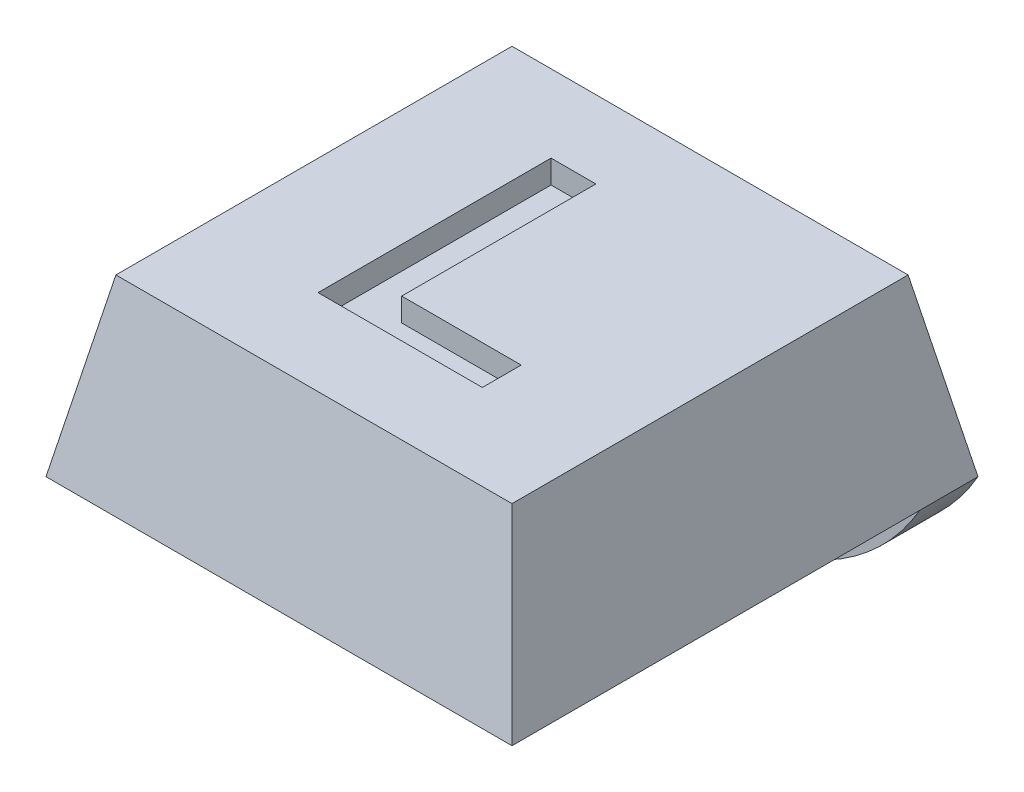
ISO-10303-21;
HEADER;
FILE_DESCRIPTION(('STEP AP214'),'2;1');
FILE_NAME('part.step','',(''),(''),'','','');
FILE_SCHEMA(('AUTOMOTIVE_DESIGN { 1 0 10303 214 1 1 1 1 }'));
ENDSEC;
DATA;
#1=APPLICATION_CONTEXT('core data for automotive mechanical design processes');
#2=APPLICATION_PROTOCOL_DEFINITION('international standard','automotive_design',2000,#1);
#3=PRODUCT_CONTEXT('',#1,'mechanical');
#4=PRODUCT('Part','Part','',(#3));
#5=PRODUCT_RELATED_PRODUCT_CATEGORY('part','',(#4));
#6=PRODUCT_DEFINITION_FORMATION('','',#4);
#7=PRODUCT_DEFINITION_CONTEXT('part definition',#1,'design');
#8=PRODUCT_DEFINITION('design','',#6,#7);
#9=PRODUCT_DEFINITION_SHAPE('','',#8);
#10=(LENGTH_UNIT() NAMED_UNIT(*) SI_UNIT(.MILLI.,.METRE.));
#11=(NAMED_UNIT(*) PLANE_ANGLE_UNIT() SI_UNIT($,.RADIAN.));
#12=(NAMED_UNIT(*) SI_UNIT($,.STERADIAN.) SOLID_ANGLE_UNIT());
#13=UNCERTAINTY_MEASURE_WITH_UNIT(LENGTH_MEASURE(1.E-05),#10,'distance_accuracy_value','');
#14=(GEOMETRIC_REPRESENTATION_CONTEXT(3) GLOBAL_UNCERTAINTY_ASSIGNED_CONTEXT((#13)) GLOBAL_UNIT_ASSIGNED_CONTEXT((#10,
#11,#12)) REPRESENTATION_CONTEXT('',''));
#15=CARTESIAN_POINT('',(0.,0.,0.));
#16=DIRECTION('',(0.,0.,1.));
#17=DIRECTION('',(1.,0.,0.));
#18=AXIS2_PLACEMENT_3D('',#15,#16,#17);
#19=CARTESIAN_POINT('',(0.,3.,0.));
#20=DIRECTION('',(0.,-1.,0.));
#21=DIRECTION('',(0.,0.,-1.));
#22=AXIS2_PLACEMENT_3D('',#19,#20,#21);
#23=PLANE('',#22);
#24=DIRECTION('',(-1.,0.,0.));
#25=VECTOR('',#24,1.);
#26=CARTESIAN_POINT('',(11.,3.,-0.6));
#27=LINE('',#26,#25);
#28=CARTESIAN_POINT('',(7.4,3.,-0.6));
#29=VERTEX_POINT('',#28);
#30=CARTESIAN_POINT('',(0.6,3.,-0.6));
#31=VERTEX_POINT('',#30);
#32=EDGE_CURVE('E193',#29,#31,#27,.T.);
#33=ORIENTED_EDGE('',*,*,#32,.F.);
#34=DIRECTION('',(0.,0.,1.));
#35=VECTOR('',#34,1.);
#36=CARTESIAN_POINT('',(7.4,3.,-8.));
#37=LINE('',#36,#35);
#38=CARTESIAN_POINT('',(7.4,3.,-7.4));
#39=VERTEX_POINT('',#38);
#40=EDGE_CURVE('E206',#39,#29,#37,.T.);
#41=ORIENTED_EDGE('',*,*,#40,.F.);
#42=DIRECTION('',(-1.,0.,0.));
#43=VECTOR('',#42,1.);
#44=CARTESIAN_POINT('',(11.,3.,-7.4));
#45=LINE('',#44,#43);
#46=CARTESIAN_POINT('',(0.599999999999999,3.,-7.4));
#47=VERTEX_POINT('',#46);
#48=EDGE_CURVE('E189',#39,#47,#45,.T.);
#49=ORIENTED_EDGE('',*,*,#48,.T.);
#50=DIRECTION('',(0.,0.,1.));
#51=VECTOR('',#50,1.);
#52=CARTESIAN_POINT('',(0.6,3.,-8.));
#53=LINE('',#52,#51);
#54=EDGE_CURVE('E209',#47,#31,#53,.T.);
#55=ORIENTED_EDGE('',*,*,#54,.T.);
#56=EDGE_LOOP('',(#33,#41,#49,#55));
#57=FACE_BOUND('',#56,.T.);
#58=DIRECTION('',(-1.,0.,0.));
#59=VECTOR('',#58,1.);
#60=CARTESIAN_POINT('',(5.41871403816439,3.,-2.07225420999487));
#61=LINE('',#60,#59);
#62=CARTESIAN_POINT('',(5.41871403816439,3.,-2.07225420999487));
#63=VERTEX_POINT('',#62);
#64=CARTESIAN_POINT('',(2.59820121765157,3.,-2.07225420999487));
#65=VERTEX_POINT('',#64);
#66=EDGE_CURVE('E58',#63,#65,#61,.T.);
#67=ORIENTED_EDGE('',*,*,#66,.T.);
#68=DIRECTION('',(0.,0.,-1.));
#69=VECTOR('',#68,1.);
#70=CARTESIAN_POINT('',(2.59820121765157,3.,-2.07225420999487));
#71=LINE('',#70,#69);
#72=CARTESIAN_POINT('',(2.59820121765157,3.,-6.07225420999487));
#73=VERTEX_POINT('',#72);
#74=EDGE_CURVE('E161',#65,#73,#71,.T.);
#75=ORIENTED_EDGE('',*,*,#74,.T.);
#76=DIRECTION('',(1.,0.,0.));
#77=VECTOR('',#76,1.);
#78=CARTESIAN_POINT('',(2.59820121765157,3.,-6.07225420999487));
#79=LINE('',#78,#77);
#80=CARTESIAN_POINT('',(3.36743198688234,3.,-6.07225420999487));
#81=VERTEX_POINT('',#80);
#82=EDGE_CURVE('E524',#73,#81,#79,.T.);
#83=ORIENTED_EDGE('',*,*,#82,.T.);
#84=DIRECTION('',(0.,0.,1.));
#85=VECTOR('',#84,1.);
#86=CARTESIAN_POINT('',(3.36743198688234,3.,-6.07225420999487));
#87=LINE('',#86,#85);
#88=CARTESIAN_POINT('',(3.36743198688234,3.,-2.73892087666153));
#89=VERTEX_POINT('',#88);
#90=EDGE_CURVE('E519',#81,#89,#87,.T.);
#91=ORIENTED_EDGE('',*,*,#90,.T.);
#92=DIRECTION('',(1.,0.,0.));
#93=VECTOR('',#92,1.);
#94=CARTESIAN_POINT('',(3.36743198688234,3.,-2.73892087666153));
#95=LINE('',#94,#93);
#96=CARTESIAN_POINT('',(5.41871403816439,3.,-2.73892087666153));
#97=VERTEX_POINT('',#96);
#98=EDGE_CURVE('E513',#89,#97,#95,.T.);
#99=ORIENTED_EDGE('',*,*,#98,.T.);
#100=DIRECTION('',(0.,0.,1.));
#101=VECTOR('',#100,1.);
#102=CARTESIAN_POINT('',(5.41871403816439,3.,-2.73892087666153));
#103=LINE('',#102,#101);
#104=EDGE_CURVE('E157',#97,#63,#103,.T.);
#105=ORIENTED_EDGE('',*,*,#104,.T.);
#106=EDGE_LOOP('',(#67,#75,#83,#91,#99,#105));
#107=FACE_BOUND('',#106,.T.);
#108=ADVANCED_FACE('F42',(#57,#107),#23,.F.);
#109=CARTESIAN_POINT('',(8.,0.,-8.));
#110=DIRECTION('',(-0.98058067569092,-0.196116135138184,0.));
#111=DIRECTION('',(0.196116135138184,-0.98058067569092,0.));
#112=AXIS2_PLACEMENT_3D('',#109,#110,#111);
#113=PLANE('',#112);
#114=DIRECTION('',(-0.192450089729875,0.962250448649376,-0.192450089729875));
#115=VECTOR('',#114,1.);
#116=CARTESIAN_POINT('',(7.7037037037037,1.48148148148148,-0.296296296296296));
#117=LINE('',#116,#115);
#118=CARTESIAN_POINT('',(8.,0.,0.));
#119=VERTEX_POINT('',#118);
#120=EDGE_CURVE('E203',#119,#29,#117,.T.);
#121=ORIENTED_EDGE('',*,*,#120,.F.);
#122=DIRECTION('',(0.,0.,-1.));
#123=VECTOR('',#122,1.);
#124=CARTESIAN_POINT('',(8.,0.,0.));
#125=LINE('',#124,#123);
#126=CARTESIAN_POINT('',(8.,0.,-7.));
#127=VERTEX_POINT('',#126);
#128=EDGE_CURVE('E222',#119,#127,#125,.T.);
#129=ORIENTED_EDGE('',*,*,#128,.T.);
#130=DIRECTION('',(0.,0.,1.));
#131=VECTOR('',#130,1.);
#132=CARTESIAN_POINT('',(8.,0.,-8.));
#133=LINE('',#132,#131);
#134=CARTESIAN_POINT('',(8.,0.,-8.));
#135=VERTEX_POINT('',#134);
#136=EDGE_CURVE('E163',#135,#127,#133,.T.);
#137=ORIENTED_EDGE('',*,*,#136,.F.);
#138=DIRECTION('',(0.192450089729875,-0.962250448649376,-0.192450089729875));
#139=VECTOR('',#138,1.);
#140=CARTESIAN_POINT('',(8.,0.,-8.));
#141=LINE('',#140,#139);
#142=EDGE_CURVE('E196',#39,#135,#141,.T.);
#143=ORIENTED_EDGE('',*,*,#142,.F.);
#144=ORIENTED_EDGE('',*,*,#40,.T.);
#145=EDGE_LOOP('',(#121,#129,#137,#143,#144));
#146=FACE_BOUND('',#145,.T.);
#147=ADVANCED_FACE('F290',(#146),#113,.F.);
#148=CARTESIAN_POINT('',(0.,0.,-8.));
#149=DIRECTION('',(0.98058067569092,-0.196116135138184,0.));
#150=DIRECTION('',(0.196116135138184,0.98058067569092,0.));
#151=AXIS2_PLACEMENT_3D('',#148,#149,#150);
#152=PLANE('',#151);
#153=DIRECTION('',(-0.192450089729875,-0.962250448649376,0.192450089729875));
#154=VECTOR('',#153,1.);
#155=CARTESIAN_POINT('',(0.296296296296296,1.48148148148148,-0.296296296296296));
#156=LINE('',#155,#154);
#157=CARTESIAN_POINT('',(0.,0.,0.));
#158=VERTEX_POINT('',#157);
#159=EDGE_CURVE('E250',#31,#158,#156,.T.);
#160=ORIENTED_EDGE('',*,*,#159,.F.);
#161=ORIENTED_EDGE('',*,*,#54,.F.);
#162=DIRECTION('',(0.192450089729875,0.962250448649376,0.192450089729875));
#163=VECTOR('',#162,1.);
#164=CARTESIAN_POINT('',(0.,0.,-8.));
#165=LINE('',#164,#163);
#166=CARTESIAN_POINT('',(0.,0.,-8.));
#167=VERTEX_POINT('',#166);
#168=EDGE_CURVE('E221',#167,#47,#165,.T.);
#169=ORIENTED_EDGE('',*,*,#168,.F.);
#170=DIRECTION('',(0.,0.,1.));
#171=VECTOR('',#170,1.);
#172=CARTESIAN_POINT('',(0.,0.,0.));
#173=LINE('',#172,#171);
#174=CARTESIAN_POINT('',(0.,0.,-7.));
#175=VERTEX_POINT('',#174);
#176=EDGE_CURVE('E226',#167,#175,#173,.T.);
#177=ORIENTED_EDGE('',*,*,#176,.T.);
#178=EDGE_CURVE('E213',#175,#158,#173,.T.);
#179=ORIENTED_EDGE('',*,*,#178,.T.);
#180=EDGE_LOOP('',(#160,#161,#169,#177,#179));
#181=FACE_BOUND('',#180,.T.);
#182=ADVANCED_FACE('F274',(#181),#152,.F.);
#183=CARTESIAN_POINT('',(0.,0.,0.));
#184=DIRECTION('',(0.,-1.,0.));
#185=DIRECTION('',(0.,0.,-1.));
#186=AXIS2_PLACEMENT_3D('',#183,#184,#185);
#187=PLANE('',#186);
#188=DIRECTION('',(-1.,0.,0.));
#189=VECTOR('',#188,1.);
#190=CARTESIAN_POINT('',(0.,0.,-7.));
#191=LINE('',#190,#189);
#192=EDGE_CURVE('E169',#127,#175,#191,.T.);
#193=ORIENTED_EDGE('',*,*,#192,.F.);
#194=ORIENTED_EDGE('',*,*,#128,.F.);
#195=DIRECTION('',(1.,0.,0.));
#196=VECTOR('',#195,1.);
#197=CARTESIAN_POINT('',(0.,0.,0.));
#198=LINE('',#197,#196);
#199=EDGE_CURVE('E223',#158,#119,#198,.T.);
#200=ORIENTED_EDGE('',*,*,#199,.F.);
#201=ORIENTED_EDGE('',*,*,#178,.F.);
#202=EDGE_LOOP('',(#193,#194,#200,#201));
#203=FACE_BOUND('',#202,.T.);
#204=CARTESIAN_POINT('',(4.,0.,-3.75));
#205=DIRECTION('',(0.,-1.,0.));
#206=DIRECTION('',(0.,0.,-1.));
#207=AXIS2_PLACEMENT_3D('',#204,#205,#206);
#208=CIRCLE('',#207,1.8);
#209=CARTESIAN_POINT('',(4.,0.,-5.55));
#210=VERTEX_POINT('',#209);
#211=EDGE_CURVE('E181',#210,#210,#208,.T.);
#212=ORIENTED_EDGE('',*,*,#211,.F.);
#213=EDGE_LOOP('',(#212));
#214=FACE_BOUND('',#213,.T.);
#215=ADVANCED_FACE('F285',(#203,#214),#187,.T.);
#216=CARTESIAN_POINT('',(11.,3.,-7.4));
#217=DIRECTION('',(0.,0.196116135138184,-0.98058067569092));
#218=DIRECTION('',(0.,0.98058067569092,0.196116135138184));
#219=AXIS2_PLACEMENT_3D('',#216,#217,#218);
#220=PLANE('',#219);
#221=ORIENTED_EDGE('',*,*,#142,.T.);
#222=DIRECTION('',(-1.,0.,0.));
#223=VECTOR('',#222,1.);
#224=CARTESIAN_POINT('',(0.,0.,-8.));
#225=LINE('',#224,#223);
#226=EDGE_CURVE('E217',#135,#167,#225,.T.);
#227=ORIENTED_EDGE('',*,*,#226,.T.);
#228=ORIENTED_EDGE('',*,*,#168,.T.);
#229=ORIENTED_EDGE('',*,*,#48,.F.);
#230=EDGE_LOOP('',(#221,#227,#228,#229));
#231=FACE_BOUND('',#230,.T.);
#232=ADVANCED_FACE('F269',(#231),#220,.T.);
#233=CARTESIAN_POINT('',(11.,0.,0.));
#234=DIRECTION('',(0.,0.196116135138184,0.98058067569092));
#235=DIRECTION('',(0.,-0.98058067569092,0.196116135138184));
#236=AXIS2_PLACEMENT_3D('',#233,#234,#235);
#237=PLANE('',#236);
#238=ORIENTED_EDGE('',*,*,#120,.T.);
#239=ORIENTED_EDGE('',*,*,#32,.T.);
#240=ORIENTED_EDGE('',*,*,#159,.T.);
#241=ORIENTED_EDGE('',*,*,#199,.T.);
#242=EDGE_LOOP('',(#238,#239,#240,#241));
#243=FACE_BOUND('',#242,.T.);
#244=ADVANCED_FACE('F316',(#243),#237,.T.);
#245=CARTESIAN_POINT('',(4.,0.8,-3.75));
#246=DIRECTION('',(0.,-1.,0.));
#247=DIRECTION('',(0.,0.,-1.));
#248=AXIS2_PLACEMENT_3D('',#245,#246,#247);
#249=CYLINDRICAL_SURFACE('',#248,1.8);
#250=CARTESIAN_POINT('',(4.,0.8,-3.75));
#251=DIRECTION('',(0.,-1.,0.));
#252=DIRECTION('',(0.,0.,-1.));
#253=AXIS2_PLACEMENT_3D('',#250,#251,#252);
#254=CIRCLE('',#253,1.8);
#255=CARTESIAN_POINT('',(4.,0.8,-5.55));
#256=VERTEX_POINT('',#255);
#257=EDGE_CURVE('E185',#256,#256,#254,.T.);
#258=ORIENTED_EDGE('',*,*,#257,.F.);
#259=EDGE_LOOP('',(#258));
#260=FACE_BOUND('',#259,.T.);
#261=ORIENTED_EDGE('',*,*,#211,.T.);
#262=EDGE_LOOP('',(#261));
#263=FACE_BOUND('',#262,.T.);
#264=ADVANCED_FACE('F323',(#260,#263),#249,.F.);
#265=CARTESIAN_POINT('',(4.,0.8,-3.75));
#266=DIRECTION('',(0.,-1.,0.));
#267=DIRECTION('',(0.,0.,-1.));
#268=AXIS2_PLACEMENT_3D('',#265,#266,#267);
#269=PLANE('',#268);
#270=ORIENTED_EDGE('',*,*,#257,.T.);
#271=EDGE_LOOP('',(#270));
#272=FACE_BOUND('',#271,.T.);
#273=ADVANCED_FACE('F327',(#272),#269,.T.);
#274=CARTESIAN_POINT('',(0.,-2.,-8.));
#275=DIRECTION('',(0.,0.,1.));
#276=DIRECTION('',(1.,0.,0.));
#277=AXIS2_PLACEMENT_3D('',#274,#275,#276);
#278=PLANE('',#277);
#279=ORIENTED_EDGE('',*,*,#226,.F.);
#280=CARTESIAN_POINT('',(4.53589838486225,2.,-8.));
#281=DIRECTION('',(0.,0.,1.));
#282=DIRECTION('',(1.,0.,0.));
#283=AXIS2_PLACEMENT_3D('',#280,#281,#282);
#284=CIRCLE('',#283,4.);
#285=CARTESIAN_POINT('',(4.53589838486225,-2.,-8.));
#286=VERTEX_POINT('',#285);
#287=EDGE_CURVE('E11',#135,#286,#284,.F.);
#288=ORIENTED_EDGE('',*,*,#287,.T.);
#289=DIRECTION('',(1.,0.,0.));
#290=VECTOR('',#289,1.);
#291=CARTESIAN_POINT('',(0.,-2.,-8.));
#292=LINE('',#291,#290);
#293=CARTESIAN_POINT('',(3.46410161513775,-2.,-8.));
#294=VERTEX_POINT('',#293);
#295=EDGE_CURVE('E175',#294,#286,#292,.T.);
#296=ORIENTED_EDGE('',*,*,#295,.F.);
#297=CARTESIAN_POINT('',(3.46410161513775,2.,-8.));
#298=DIRECTION('',(0.,0.,1.));
#299=DIRECTION('',(1.,0.,0.));
#300=AXIS2_PLACEMENT_3D('',#297,#298,#299);
#301=CIRCLE('',#300,4.);
#302=EDGE_CURVE('E51',#294,#167,#301,.F.);
#303=ORIENTED_EDGE('',*,*,#302,.T.);
#304=EDGE_LOOP('',(#279,#288,#296,#303));
#305=FACE_BOUND('',#304,.T.);
#306=ADVANCED_FACE('F262',(#305),#278,.F.);
#307=CARTESIAN_POINT('',(0.,-2.,-7.));
#308=DIRECTION('',(0.,0.,-1.));
#309=DIRECTION('',(-1.,0.,0.));
#310=AXIS2_PLACEMENT_3D('',#307,#308,#309);
#311=PLANE('',#310);
#312=DIRECTION('',(-1.,0.,0.));
#313=VECTOR('',#312,1.);
#314=CARTESIAN_POINT('',(0.,-2.,-7.));
#315=LINE('',#314,#313);
#316=CARTESIAN_POINT('',(4.53589838486225,-2.,-7.));
#317=VERTEX_POINT('',#316);
#318=CARTESIAN_POINT('',(3.46410161513775,-2.,-7.));
#319=VERTEX_POINT('',#318);
#320=EDGE_CURVE('E179',#317,#319,#315,.T.);
#321=ORIENTED_EDGE('',*,*,#320,.F.);
#322=CARTESIAN_POINT('',(4.53589838486225,2.,-7.));
#323=DIRECTION('',(0.,0.,-1.));
#324=DIRECTION('',(-1.,0.,0.));
#325=AXIS2_PLACEMENT_3D('',#322,#323,#324);
#326=CIRCLE('',#325,4.);
#327=EDGE_CURVE('E256',#317,#127,#326,.F.);
#328=ORIENTED_EDGE('',*,*,#327,.T.);
#329=ORIENTED_EDGE('',*,*,#192,.T.);
#330=CARTESIAN_POINT('',(3.46410161513775,2.,-7.));
#331=DIRECTION('',(0.,0.,-1.));
#332=DIRECTION('',(-1.,0.,0.));
#333=AXIS2_PLACEMENT_3D('',#330,#331,#332);
#334=CIRCLE('',#333,4.);
#335=EDGE_CURVE('E66',#175,#319,#334,.F.);
#336=ORIENTED_EDGE('',*,*,#335,.T.);
#337=EDGE_LOOP('',(#321,#328,#329,#336));
#338=FACE_BOUND('',#337,.T.);
#339=ADVANCED_FACE('F280',(#338),#311,.F.);
#340=CARTESIAN_POINT('',(0.,-2.,0.));
#341=DIRECTION('',(0.,1.,0.));
#342=DIRECTION('',(0.,0.,1.));
#343=AXIS2_PLACEMENT_3D('',#340,#341,#342);
#344=PLANE('',#343);
#345=ORIENTED_EDGE('',*,*,#295,.T.);
#346=DIRECTION('',(0.,0.,1.));
#347=VECTOR('',#346,1.);
#348=CARTESIAN_POINT('',(4.53589838486225,-2.,0.));
#349=LINE('',#348,#347);
#350=EDGE_CURVE('E249',#286,#317,#349,.T.);
#351=ORIENTED_EDGE('',*,*,#350,.T.);
#352=ORIENTED_EDGE('',*,*,#320,.T.);
#353=DIRECTION('',(0.,0.,-1.));
#354=VECTOR('',#353,1.);
#355=CARTESIAN_POINT('',(3.46410161513775,-2.,0.));
#356=LINE('',#355,#354);
#357=EDGE_CURVE('E245',#319,#294,#356,.T.);
#358=ORIENTED_EDGE('',*,*,#357,.T.);
#359=EDGE_LOOP('',(#345,#351,#352,#358));
#360=FACE_BOUND('',#359,.T.);
#361=ADVANCED_FACE('F278',(#360),#344,.F.);
#362=CARTESIAN_POINT('',(4.53589838486225,2.,-8.));
#363=DIRECTION('',(0.,0.,1.));
#364=DIRECTION('',(1.,0.,0.));
#365=AXIS2_PLACEMENT_3D('',#362,#363,#364);
#366=CYLINDRICAL_SURFACE('',#365,4.);
#367=ORIENTED_EDGE('',*,*,#287,.F.);
#368=ORIENTED_EDGE('',*,*,#136,.T.);
#369=ORIENTED_EDGE('',*,*,#327,.F.);
#370=ORIENTED_EDGE('',*,*,#350,.F.);
#371=EDGE_LOOP('',(#367,#368,#369,#370));
#372=FACE_BOUND('',#371,.T.);
#373=ADVANCED_FACE('F291',(#372),#366,.T.);
#374=CARTESIAN_POINT('',(3.46410161513775,2.,-8.));
#375=DIRECTION('',(0.,0.,-1.));
#376=DIRECTION('',(-1.,0.,0.));
#377=AXIS2_PLACEMENT_3D('',#374,#375,#376);
#378=CYLINDRICAL_SURFACE('',#377,4.);
#379=ORIENTED_EDGE('',*,*,#335,.F.);
#380=ORIENTED_EDGE('',*,*,#176,.F.);
#381=ORIENTED_EDGE('',*,*,#302,.F.);
#382=ORIENTED_EDGE('',*,*,#357,.F.);
#383=EDGE_LOOP('',(#379,#380,#381,#382));
#384=FACE_BOUND('',#383,.T.);
#385=ADVANCED_FACE('F44',(#384),#378,.T.);
#386=CARTESIAN_POINT('',(5.41871403816439,2.6,-2.07225420999487));
#387=DIRECTION('',(0.,0.,-1.));
#388=DIRECTION('',(-1.,0.,0.));
#389=AXIS2_PLACEMENT_3D('',#386,#387,#388);
#390=PLANE('',#389);
#391=ORIENTED_EDGE('',*,*,#66,.F.);
#392=DIRECTION('',(0.,1.,0.));
#393=VECTOR('',#392,1.);
#394=CARTESIAN_POINT('',(5.41871403816439,2.6,-2.07225420999487));
#395=LINE('',#394,#393);
#396=CARTESIAN_POINT('',(5.41871403816439,2.6,-2.07225420999487));
#397=VERTEX_POINT('',#396);
#398=EDGE_CURVE('E155',#397,#63,#395,.T.);
#399=ORIENTED_EDGE('',*,*,#398,.F.);
#400=DIRECTION('',(-1.,0.,0.));
#401=VECTOR('',#400,1.);
#402=CARTESIAN_POINT('',(5.41871403816439,2.6,-2.07225420999487));
#403=LINE('',#402,#401);
#404=CARTESIAN_POINT('',(2.59820121765157,2.6,-2.07225420999487));
#405=VERTEX_POINT('',#404);
#406=EDGE_CURVE('E145',#397,#405,#403,.T.);
#407=ORIENTED_EDGE('',*,*,#406,.T.);
#408=DIRECTION('',(0.,1.,0.));
#409=VECTOR('',#408,1.);
#410=CARTESIAN_POINT('',(2.59820121765157,2.6,-2.07225420999487));
#411=LINE('',#410,#409);
#412=EDGE_CURVE('E154',#405,#65,#411,.T.);
#413=ORIENTED_EDGE('',*,*,#412,.T.);
#414=EDGE_LOOP('',(#391,#399,#407,#413));
#415=FACE_BOUND('',#414,.T.);
#416=ADVANCED_FACE('F153',(#415),#390,.T.);
#417=CARTESIAN_POINT('',(2.59820121765157,2.6,-2.07225420999487));
#418=DIRECTION('',(1.,0.,0.));
#419=DIRECTION('',(0.,0.,-1.));
#420=AXIS2_PLACEMENT_3D('',#417,#418,#419);
#421=PLANE('',#420);
#422=ORIENTED_EDGE('',*,*,#74,.F.);
#423=ORIENTED_EDGE('',*,*,#412,.F.);
#424=DIRECTION('',(0.,0.,-1.));
#425=VECTOR('',#424,1.);
#426=CARTESIAN_POINT('',(2.59820121765157,2.6,-2.07225420999487));
#427=LINE('',#426,#425);
#428=CARTESIAN_POINT('',(2.59820121765157,2.6,-6.07225420999487));
#429=VERTEX_POINT('',#428);
#430=EDGE_CURVE('E141',#405,#429,#427,.T.);
#431=ORIENTED_EDGE('',*,*,#430,.T.);
#432=DIRECTION('',(0.,1.,0.));
#433=VECTOR('',#432,1.);
#434=CARTESIAN_POINT('',(2.59820121765157,2.6,-6.07225420999487));
#435=LINE('',#434,#433);
#436=EDGE_CURVE('E164',#429,#73,#435,.T.);
#437=ORIENTED_EDGE('',*,*,#436,.T.);
#438=EDGE_LOOP('',(#422,#423,#431,#437));
#439=FACE_BOUND('',#438,.T.);
#440=ADVANCED_FACE('F159',(#439),#421,.T.);
#441=CARTESIAN_POINT('',(2.59820121765157,2.6,-6.07225420999487));
#442=DIRECTION('',(0.,0.,1.));
#443=DIRECTION('',(1.,0.,0.));
#444=AXIS2_PLACEMENT_3D('',#441,#442,#443);
#445=PLANE('',#444);
#446=ORIENTED_EDGE('',*,*,#82,.F.);
#447=ORIENTED_EDGE('',*,*,#436,.F.);
#448=DIRECTION('',(1.,0.,0.));
#449=VECTOR('',#448,1.);
#450=CARTESIAN_POINT('',(2.59820121765157,2.6,-6.07225420999487));
#451=LINE('',#450,#449);
#452=CARTESIAN_POINT('',(3.36743198688234,2.6,-6.07225420999487));
#453=VERTEX_POINT('',#452);
#454=EDGE_CURVE('E147',#429,#453,#451,.T.);
#455=ORIENTED_EDGE('',*,*,#454,.T.);
#456=DIRECTION('',(0.,1.,0.));
#457=VECTOR('',#456,1.);
#458=CARTESIAN_POINT('',(3.36743198688234,2.6,-6.07225420999487));
#459=LINE('',#458,#457);
#460=EDGE_CURVE('E171',#453,#81,#459,.T.);
#461=ORIENTED_EDGE('',*,*,#460,.T.);
#462=EDGE_LOOP('',(#446,#447,#455,#461));
#463=FACE_BOUND('',#462,.T.);
#464=ADVANCED_FACE('F340',(#463),#445,.T.);
#465=CARTESIAN_POINT('',(3.36743198688234,2.6,-6.07225420999487));
#466=DIRECTION('',(-1.,0.,0.));
#467=DIRECTION('',(0.,0.,1.));
#468=AXIS2_PLACEMENT_3D('',#465,#466,#467);
#469=PLANE('',#468);
#470=ORIENTED_EDGE('',*,*,#90,.F.);
#471=ORIENTED_EDGE('',*,*,#460,.F.);
#472=DIRECTION('',(0.,0.,1.));
#473=VECTOR('',#472,1.);
#474=CARTESIAN_POINT('',(3.36743198688234,2.6,-6.07225420999487));
#475=LINE('',#474,#473);
#476=CARTESIAN_POINT('',(3.36743198688234,2.6,-2.73892087666153));
#477=VERTEX_POINT('',#476);
#478=EDGE_CURVE('E549',#453,#477,#475,.T.);
#479=ORIENTED_EDGE('',*,*,#478,.T.);
#480=DIRECTION('',(0.,1.,0.));
#481=VECTOR('',#480,1.);
#482=CARTESIAN_POINT('',(3.36743198688234,2.6,-2.73892087666153));
#483=LINE('',#482,#481);
#484=EDGE_CURVE('E533',#477,#89,#483,.T.);
#485=ORIENTED_EDGE('',*,*,#484,.T.);
#486=EDGE_LOOP('',(#470,#471,#479,#485));
#487=FACE_BOUND('',#486,.T.);
#488=ADVANCED_FACE('F343',(#487),#469,.T.);
#489=CARTESIAN_POINT('',(3.36743198688234,2.6,-2.73892087666153));
#490=DIRECTION('',(0.,0.,1.));
#491=DIRECTION('',(1.,0.,0.));
#492=AXIS2_PLACEMENT_3D('',#489,#490,#491);
#493=PLANE('',#492);
#494=ORIENTED_EDGE('',*,*,#98,.F.);
#495=ORIENTED_EDGE('',*,*,#484,.F.);
#496=DIRECTION('',(1.,0.,0.));
#497=VECTOR('',#496,1.);
#498=CARTESIAN_POINT('',(3.36743198688234,2.6,-2.73892087666153));
#499=LINE('',#498,#497);
#500=CARTESIAN_POINT('',(5.41871403816439,2.6,-2.73892087666153));
#501=VERTEX_POINT('',#500);
#502=EDGE_CURVE('E546',#477,#501,#499,.T.);
#503=ORIENTED_EDGE('',*,*,#502,.T.);
#504=DIRECTION('',(0.,1.,0.));
#505=VECTOR('',#504,1.);
#506=CARTESIAN_POINT('',(5.41871403816439,2.6,-2.73892087666153));
#507=LINE('',#506,#505);
#508=EDGE_CURVE('E511',#501,#97,#507,.T.);
#509=ORIENTED_EDGE('',*,*,#508,.T.);
#510=EDGE_LOOP('',(#494,#495,#503,#509));
#511=FACE_BOUND('',#510,.T.);
#512=ADVANCED_FACE('F347',(#511),#493,.T.);
#513=CARTESIAN_POINT('',(5.41871403816439,2.6,-2.73892087666153));
#514=DIRECTION('',(-1.,0.,0.));
#515=DIRECTION('',(0.,0.,1.));
#516=AXIS2_PLACEMENT_3D('',#513,#514,#515);
#517=PLANE('',#516);
#518=ORIENTED_EDGE('',*,*,#104,.F.);
#519=ORIENTED_EDGE('',*,*,#508,.F.);
#520=DIRECTION('',(0.,0.,1.));
#521=VECTOR('',#520,1.);
#522=CARTESIAN_POINT('',(5.41871403816439,2.6,-2.73892087666153));
#523=LINE('',#522,#521);
#524=EDGE_CURVE('E530',#501,#397,#523,.T.);
#525=ORIENTED_EDGE('',*,*,#524,.T.);
#526=ORIENTED_EDGE('',*,*,#398,.T.);
#527=EDGE_LOOP('',(#518,#519,#525,#526));
#528=FACE_BOUND('',#527,.T.);
#529=ADVANCED_FACE('F351',(#528),#517,.T.);
#530=CARTESIAN_POINT('',(0.,2.6,0.));
#531=DIRECTION('',(0.,-1.,0.));
#532=DIRECTION('',(0.,0.,-1.));
#533=AXIS2_PLACEMENT_3D('',#530,#531,#532);
#534=PLANE('',#533);
#535=ORIENTED_EDGE('',*,*,#406,.F.);
#536=ORIENTED_EDGE('',*,*,#524,.F.);
#537=ORIENTED_EDGE('',*,*,#502,.F.);
#538=ORIENTED_EDGE('',*,*,#478,.F.);
#539=ORIENTED_EDGE('',*,*,#454,.F.);
#540=ORIENTED_EDGE('',*,*,#430,.F.);
#541=EDGE_LOOP('',(#535,#536,#537,#538,#539,#540));
#542=FACE_BOUND('',#541,.T.);
#543=ADVANCED_FACE('F143',(#542),#534,.F.);
#544=CLOSED_SHELL('',(#108,#147,#182,#215,#232,#244,#264,#273,#306,#339,#361,#373,#385,#416,
#440,#464,#488,#512,#529,#543));
#545=MANIFOLD_SOLID_BREP('B2',#544);
#546=ADVANCED_BREP_SHAPE_REPRESENTATION('',(#18,#545),#14);
#547=SHAPE_DEFINITION_REPRESENTATION(#9,#546);
ENDSEC;
END-ISO-10303-21;
